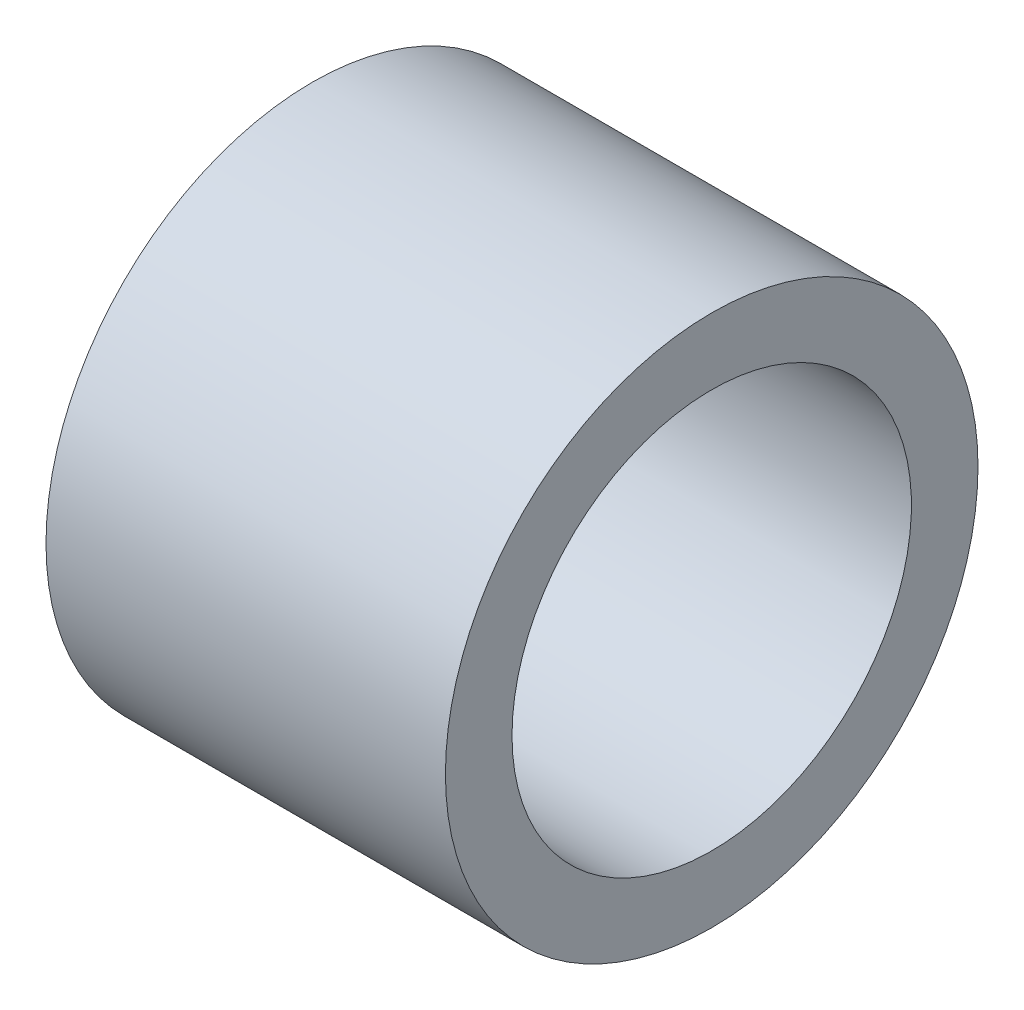
ISO-10303-21;
HEADER;
FILE_DESCRIPTION(('STEP AP214'),'2;1');
FILE_NAME('part.step','',(''),(''),'','','');
FILE_SCHEMA(('AUTOMOTIVE_DESIGN { 1 0 10303 214 1 1 1 1 }'));
ENDSEC;
DATA;
#1=APPLICATION_CONTEXT('core data for automotive mechanical design processes');
#2=APPLICATION_PROTOCOL_DEFINITION('international standard','automotive_design',2000,#1);
#3=PRODUCT_CONTEXT('',#1,'mechanical');
#4=PRODUCT('Part','Part','',(#3));
#5=PRODUCT_RELATED_PRODUCT_CATEGORY('part','',(#4));
#6=PRODUCT_DEFINITION_FORMATION('','',#4);
#7=PRODUCT_DEFINITION_CONTEXT('part definition',#1,'design');
#8=PRODUCT_DEFINITION('design','',#6,#7);
#9=PRODUCT_DEFINITION_SHAPE('','',#8);
#10=(LENGTH_UNIT() NAMED_UNIT(*) SI_UNIT(.MILLI.,.METRE.));
#11=(NAMED_UNIT(*) PLANE_ANGLE_UNIT() SI_UNIT($,.RADIAN.));
#12=(NAMED_UNIT(*) SI_UNIT($,.STERADIAN.) SOLID_ANGLE_UNIT());
#13=UNCERTAINTY_MEASURE_WITH_UNIT(LENGTH_MEASURE(1.E-05),#10,'distance_accuracy_value','');
#14=(GEOMETRIC_REPRESENTATION_CONTEXT(3) GLOBAL_UNCERTAINTY_ASSIGNED_CONTEXT((#13)) GLOBAL_UNIT_ASSIGNED_CONTEXT((#10,
#11,#12)) REPRESENTATION_CONTEXT('',''));
#15=CARTESIAN_POINT('',(0.,0.,0.));
#16=DIRECTION('',(0.,0.,1.));
#17=DIRECTION('',(1.,0.,0.));
#18=AXIS2_PLACEMENT_3D('',#15,#16,#17);
#19=CARTESIAN_POINT('',(9.525,0.,0.));
#20=DIRECTION('',(1.,0.,0.));
#21=DIRECTION('',(0.,0.,-1.));
#22=AXIS2_PLACEMENT_3D('',#19,#20,#21);
#23=PLANE('',#22);
#24=CARTESIAN_POINT('',(9.525,0.,0.));
#25=DIRECTION('',(1.,0.,0.));
#26=DIRECTION('',(0.,0.,-1.));
#27=AXIS2_PLACEMENT_3D('',#24,#25,#26);
#28=CIRCLE('',#27,12.7);
#29=CARTESIAN_POINT('',(9.525,0.,12.7));
#30=VERTEX_POINT('',#29);
#31=EDGE_CURVE('E10',#30,#30,#28,.T.);
#32=ORIENTED_EDGE('',*,*,#31,.T.);
#33=EDGE_LOOP('',(#32));
#34=FACE_BOUND('',#33,.T.);
#35=CARTESIAN_POINT('',(9.525,0.,0.));
#36=DIRECTION('',(1.,0.,0.));
#37=DIRECTION('',(0.,0.,-1.));
#38=AXIS2_PLACEMENT_3D('',#35,#36,#37);
#39=CIRCLE('',#38,9.52500000000001);
#40=CARTESIAN_POINT('',(9.525,0.,9.52500000000001));
#41=VERTEX_POINT('',#40);
#42=EDGE_CURVE('E44',#41,#41,#39,.T.);
#43=ORIENTED_EDGE('',*,*,#42,.F.);
#44=EDGE_LOOP('',(#43));
#45=FACE_BOUND('',#44,.T.);
#46=ADVANCED_FACE('F33',(#34,#45),#23,.T.);
#47=CARTESIAN_POINT('',(-9.525,0.,0.));
#48=DIRECTION('',(1.,0.,0.));
#49=DIRECTION('',(0.,0.,-1.));
#50=AXIS2_PLACEMENT_3D('',#47,#48,#49);
#51=PLANE('',#50);
#52=CARTESIAN_POINT('',(-9.525,0.,0.));
#53=DIRECTION('',(1.,0.,0.));
#54=DIRECTION('',(0.,0.,-1.));
#55=AXIS2_PLACEMENT_3D('',#52,#53,#54);
#56=CIRCLE('',#55,12.7);
#57=CARTESIAN_POINT('',(-9.525,0.,12.7));
#58=VERTEX_POINT('',#57);
#59=EDGE_CURVE('E37',#58,#58,#56,.T.);
#60=ORIENTED_EDGE('',*,*,#59,.F.);
#61=EDGE_LOOP('',(#60));
#62=FACE_BOUND('',#61,.T.);
#63=CARTESIAN_POINT('',(-9.525,0.,0.));
#64=DIRECTION('',(1.,0.,0.));
#65=DIRECTION('',(0.,0.,-1.));
#66=AXIS2_PLACEMENT_3D('',#63,#64,#65);
#67=CIRCLE('',#66,9.52500000000001);
#68=CARTESIAN_POINT('',(-9.525,0.,9.52500000000001));
#69=VERTEX_POINT('',#68);
#70=EDGE_CURVE('E46',#69,#69,#67,.T.);
#71=ORIENTED_EDGE('',*,*,#70,.T.);
#72=EDGE_LOOP('',(#71));
#73=FACE_BOUND('',#72,.T.);
#74=ADVANCED_FACE('F56',(#62,#73),#51,.F.);
#75=CARTESIAN_POINT('',(9.525,0.,0.));
#76=DIRECTION('',(-1.,0.,0.));
#77=DIRECTION('',(0.,0.,1.));
#78=AXIS2_PLACEMENT_3D('',#75,#76,#77);
#79=CYLINDRICAL_SURFACE('',#78,12.7);
#80=CARTESIAN_POINT('',(9.525,0.,12.7));
#81=CARTESIAN_POINT('',(9.3265625,0.,12.7));
#82=CARTESIAN_POINT('',(9.128125,0.,12.7));
#83=CARTESIAN_POINT('',(8.73125,0.,12.7));
#84=CARTESIAN_POINT('',(8.5328125,0.,12.7));
#85=CARTESIAN_POINT('',(8.1359375,0.,12.7));
#86=CARTESIAN_POINT('',(7.9375,0.,12.7));
#87=CARTESIAN_POINT('',(7.540625,0.,12.7));
#88=CARTESIAN_POINT('',(7.3421875,0.,12.7));
#89=CARTESIAN_POINT('',(6.9453125,0.,12.7));
#90=CARTESIAN_POINT('',(6.746875,0.,12.7));
#91=CARTESIAN_POINT('',(6.35,0.,12.7));
#92=CARTESIAN_POINT('',(6.1515625,0.,12.7));
#93=CARTESIAN_POINT('',(5.7546875,0.,12.7));
#94=CARTESIAN_POINT('',(5.55625,0.,12.7));
#95=CARTESIAN_POINT('',(5.159375,0.,12.7));
#96=CARTESIAN_POINT('',(4.9609375,0.,12.7));
#97=CARTESIAN_POINT('',(4.5640625,0.,12.7));
#98=CARTESIAN_POINT('',(4.365625,0.,12.7));
#99=CARTESIAN_POINT('',(3.96875,0.,12.7));
#100=CARTESIAN_POINT('',(3.7703125,0.,12.7));
#101=CARTESIAN_POINT('',(3.3734375,0.,12.7));
#102=CARTESIAN_POINT('',(3.175,0.,12.7));
#103=CARTESIAN_POINT('',(2.778125,0.,12.7));
#104=CARTESIAN_POINT('',(2.5796875,0.,12.7));
#105=CARTESIAN_POINT('',(2.1828125,0.,12.7));
#106=CARTESIAN_POINT('',(1.984375,0.,12.7));
#107=CARTESIAN_POINT('',(1.5875,0.,12.7));
#108=CARTESIAN_POINT('',(1.3890625,0.,12.7));
#109=CARTESIAN_POINT('',(0.992187499999999,0.,12.7));
#110=CARTESIAN_POINT('',(0.793749999999999,0.,12.7));
#111=CARTESIAN_POINT('',(0.396874999999998,0.,12.7));
#112=CARTESIAN_POINT('',(0.198437499999998,0.,12.7));
#113=CARTESIAN_POINT('',(-0.198437500000002,0.,12.7));
#114=CARTESIAN_POINT('',(-0.396875000000002,0.,12.7));
#115=CARTESIAN_POINT('',(-0.793750000000002,0.,12.7));
#116=CARTESIAN_POINT('',(-0.992187500000002,0.,12.7));
#117=CARTESIAN_POINT('',(-1.3890625,0.,12.7));
#118=CARTESIAN_POINT('',(-1.5875,0.,12.7));
#119=CARTESIAN_POINT('',(-1.984375,0.,12.7));
#120=CARTESIAN_POINT('',(-2.1828125,0.,12.7));
#121=CARTESIAN_POINT('',(-2.5796875,0.,12.7));
#122=CARTESIAN_POINT('',(-2.778125,0.,12.7));
#123=CARTESIAN_POINT('',(-3.175,0.,12.7));
#124=CARTESIAN_POINT('',(-3.3734375,0.,12.7));
#125=CARTESIAN_POINT('',(-3.7703125,0.,12.7));
#126=CARTESIAN_POINT('',(-3.96875,0.,12.7));
#127=CARTESIAN_POINT('',(-4.365625,0.,12.7));
#128=CARTESIAN_POINT('',(-4.5640625,0.,12.7));
#129=CARTESIAN_POINT('',(-4.9609375,0.,12.7));
#130=CARTESIAN_POINT('',(-5.159375,0.,12.7));
#131=CARTESIAN_POINT('',(-5.55625,0.,12.7));
#132=CARTESIAN_POINT('',(-5.7546875,0.,12.7));
#133=CARTESIAN_POINT('',(-6.1515625,0.,12.7));
#134=CARTESIAN_POINT('',(-6.35,0.,12.7));
#135=CARTESIAN_POINT('',(-6.746875,0.,12.7));
#136=CARTESIAN_POINT('',(-6.9453125,0.,12.7));
#137=CARTESIAN_POINT('',(-7.3421875,0.,12.7));
#138=CARTESIAN_POINT('',(-7.540625,0.,12.7));
#139=CARTESIAN_POINT('',(-7.9375,0.,12.7));
#140=CARTESIAN_POINT('',(-8.1359375,0.,12.7));
#141=CARTESIAN_POINT('',(-8.5328125,0.,12.7));
#142=CARTESIAN_POINT('',(-8.73125,0.,12.7));
#143=CARTESIAN_POINT('',(-9.128125,0.,12.7));
#144=CARTESIAN_POINT('',(-9.3265625,0.,12.7));
#145=CARTESIAN_POINT('',(-9.525,0.,12.7));
#146=B_SPLINE_CURVE_WITH_KNOTS('',3,(#80,#81,#82,#83,#84,#85,#86,#87,#88,#89,#90,#91,#92,#93,
#94,#95,#96,#97,#98,#99,#100,#101,#102,#103,#104,#105,#106,#107,#108,#109,#110,#111,#112,#113,
#114,#115,#116,#117,#118,#119,#120,#121,#122,#123,#124,#125,#126,#127,#128,#129,#130,#131,#132,
#133,#134,#135,#136,#137,#138,#139,#140,#141,#142,#143,#144,#145),.UNSPECIFIED.,.F.,.F.,(4,2,2,
2,2,2,2,2,2,2,2,2,2,2,2,2,2,2,2,2,2,2,2,2,2,2,2,2,2,2,2,2,4),(0.,0.595312499999999,1.190625,
1.7859375,2.38125,2.9765625,3.571875,4.1671875,4.7625,5.3578125,5.953125,6.5484375,7.14375,
7.7390625,8.334375,8.9296875,9.525,10.1203125,10.715625,11.3109375,11.90625,12.5015625,
13.096875,13.6921875,14.2875,14.8828125,15.478125,16.0734375,16.66875,17.2640625,17.859375,
18.4546875,19.05),.UNSPECIFIED.);
#147=EDGE_CURVE('BSEAM35',#30,#58,#146,.T.);
#148=ORIENTED_EDGE('',*,*,#31,.F.);
#149=ORIENTED_EDGE('',*,*,#59,.T.);
#150=ORIENTED_EDGE('',*,*,#147,.T.);
#151=ORIENTED_EDGE('',*,*,#147,.F.);
#152=EDGE_LOOP('',(#148,#150,#149,#151));
#153=FACE_BOUND('',#152,.T.);
#154=ADVANCED_FACE('F35',(#153),#79,.T.);
#155=CARTESIAN_POINT('',(9.525,0.,0.));
#156=DIRECTION('',(-1.,0.,0.));
#157=DIRECTION('',(0.,0.,1.));
#158=AXIS2_PLACEMENT_3D('',#155,#156,#157);
#159=CYLINDRICAL_SURFACE('',#158,9.52500000000001);
#160=CARTESIAN_POINT('',(9.525,0.,9.52500000000001));
#161=CARTESIAN_POINT('',(9.3265625,0.,9.52500000000001));
#162=CARTESIAN_POINT('',(9.128125,0.,9.52500000000001));
#163=CARTESIAN_POINT('',(8.73125,0.,9.52500000000001));
#164=CARTESIAN_POINT('',(8.5328125,0.,9.52500000000001));
#165=CARTESIAN_POINT('',(8.1359375,0.,9.52500000000001));
#166=CARTESIAN_POINT('',(7.9375,0.,9.52500000000001));
#167=CARTESIAN_POINT('',(7.540625,0.,9.52500000000001));
#168=CARTESIAN_POINT('',(7.3421875,0.,9.52500000000001));
#169=CARTESIAN_POINT('',(6.9453125,0.,9.52500000000001));
#170=CARTESIAN_POINT('',(6.746875,0.,9.52500000000001));
#171=CARTESIAN_POINT('',(6.35,0.,9.52500000000001));
#172=CARTESIAN_POINT('',(6.1515625,0.,9.52500000000001));
#173=CARTESIAN_POINT('',(5.7546875,0.,9.52500000000001));
#174=CARTESIAN_POINT('',(5.55625,0.,9.52500000000001));
#175=CARTESIAN_POINT('',(5.159375,0.,9.52500000000001));
#176=CARTESIAN_POINT('',(4.9609375,0.,9.52500000000001));
#177=CARTESIAN_POINT('',(4.5640625,0.,9.52500000000001));
#178=CARTESIAN_POINT('',(4.365625,0.,9.52500000000001));
#179=CARTESIAN_POINT('',(3.96875,0.,9.52500000000001));
#180=CARTESIAN_POINT('',(3.7703125,0.,9.52500000000001));
#181=CARTESIAN_POINT('',(3.3734375,0.,9.52500000000001));
#182=CARTESIAN_POINT('',(3.175,0.,9.52500000000001));
#183=CARTESIAN_POINT('',(2.778125,0.,9.52500000000001));
#184=CARTESIAN_POINT('',(2.5796875,0.,9.52500000000001));
#185=CARTESIAN_POINT('',(2.1828125,0.,9.52500000000001));
#186=CARTESIAN_POINT('',(1.984375,0.,9.52500000000001));
#187=CARTESIAN_POINT('',(1.5875,0.,9.52500000000001));
#188=CARTESIAN_POINT('',(1.3890625,0.,9.52500000000001));
#189=CARTESIAN_POINT('',(0.992187500000001,0.,9.52500000000001));
#190=CARTESIAN_POINT('',(0.793750000000001,0.,9.52500000000001));
#191=CARTESIAN_POINT('',(0.396875,0.,9.52500000000001));
#192=CARTESIAN_POINT('',(0.1984375,0.,9.52500000000001));
#193=CARTESIAN_POINT('',(-0.1984375,0.,9.52500000000001));
#194=CARTESIAN_POINT('',(-0.396875,0.,9.52500000000001));
#195=CARTESIAN_POINT('',(-0.793750000000001,0.,9.52500000000001));
#196=CARTESIAN_POINT('',(-0.992187500000001,0.,9.52500000000001));
#197=CARTESIAN_POINT('',(-1.3890625,0.,9.52500000000001));
#198=CARTESIAN_POINT('',(-1.5875,0.,9.52500000000001));
#199=CARTESIAN_POINT('',(-1.984375,0.,9.52500000000001));
#200=CARTESIAN_POINT('',(-2.1828125,0.,9.52500000000001));
#201=CARTESIAN_POINT('',(-2.5796875,0.,9.52500000000001));
#202=CARTESIAN_POINT('',(-2.778125,0.,9.52500000000001));
#203=CARTESIAN_POINT('',(-3.175,0.,9.52500000000001));
#204=CARTESIAN_POINT('',(-3.3734375,0.,9.52500000000001));
#205=CARTESIAN_POINT('',(-3.7703125,0.,9.52500000000001));
#206=CARTESIAN_POINT('',(-3.96875,0.,9.52500000000001));
#207=CARTESIAN_POINT('',(-4.365625,0.,9.52500000000001));
#208=CARTESIAN_POINT('',(-4.5640625,0.,9.52500000000001));
#209=CARTESIAN_POINT('',(-4.9609375,0.,9.52500000000001));
#210=CARTESIAN_POINT('',(-5.159375,0.,9.52500000000001));
#211=CARTESIAN_POINT('',(-5.55625,0.,9.52500000000001));
#212=CARTESIAN_POINT('',(-5.7546875,0.,9.52500000000001));
#213=CARTESIAN_POINT('',(-6.1515625,0.,9.52500000000001));
#214=CARTESIAN_POINT('',(-6.35,0.,9.52500000000001));
#215=CARTESIAN_POINT('',(-6.746875,0.,9.52500000000001));
#216=CARTESIAN_POINT('',(-6.9453125,0.,9.52500000000001));
#217=CARTESIAN_POINT('',(-7.3421875,0.,9.52500000000001));
#218=CARTESIAN_POINT('',(-7.540625,0.,9.52500000000001));
#219=CARTESIAN_POINT('',(-7.9375,0.,9.52500000000001));
#220=CARTESIAN_POINT('',(-8.1359375,0.,9.52500000000001));
#221=CARTESIAN_POINT('',(-8.5328125,0.,9.52500000000001));
#222=CARTESIAN_POINT('',(-8.73125,0.,9.52500000000001));
#223=CARTESIAN_POINT('',(-9.128125,0.,9.52500000000001));
#224=CARTESIAN_POINT('',(-9.3265625,0.,9.52500000000001));
#225=CARTESIAN_POINT('',(-9.525,0.,9.52500000000001));
#226=B_SPLINE_CURVE_WITH_KNOTS('',3,(#160,#161,#162,#163,#164,#165,#166,#167,#168,#169,#170,
#171,#172,#173,#174,#175,#176,#177,#178,#179,#180,#181,#182,#183,#184,#185,#186,#187,#188,#189,
#190,#191,#192,#193,#194,#195,#196,#197,#198,#199,#200,#201,#202,#203,#204,#205,#206,#207,#208,
#209,#210,#211,#212,#213,#214,#215,#216,#217,#218,#219,#220,#221,#222,#223,#224,#225),
.UNSPECIFIED.,.F.,.F.,(4,2,2,2,2,2,2,2,2,2,2,2,2,2,2,2,2,2,2,2,2,2,2,2,2,2,2,2,2,2,2,2,4),(0.,
0.5953125,1.190625,1.7859375,2.38125,2.9765625,3.571875,4.1671875,4.7625,5.3578125,5.953125,
6.5484375,7.14375,7.7390625,8.334375,8.9296875,9.525,10.1203125,10.715625,11.3109375,11.90625,
12.5015625,13.096875,13.6921875,14.2875,14.8828125,15.478125,16.0734375,16.66875,17.2640625,
17.859375,18.4546875,19.05),.UNSPECIFIED.);
#227=EDGE_CURVE('BSEAM52',#41,#69,#226,.T.);
#228=ORIENTED_EDGE('',*,*,#42,.T.);
#229=ORIENTED_EDGE('',*,*,#70,.F.);
#230=ORIENTED_EDGE('',*,*,#227,.T.);
#231=ORIENTED_EDGE('',*,*,#227,.F.);
#232=EDGE_LOOP('',(#228,#230,#229,#231));
#233=FACE_BOUND('',#232,.T.);
#234=ADVANCED_FACE('F52',(#233),#159,.F.);
#235=CLOSED_SHELL('',(#46,#74,#154,#234));
#236=MANIFOLD_SOLID_BREP('B2',#235);
#237=ADVANCED_BREP_SHAPE_REPRESENTATION('',(#18,#236),#14);
#238=SHAPE_DEFINITION_REPRESENTATION(#9,#237);
ENDSEC;
END-ISO-10303-21;
